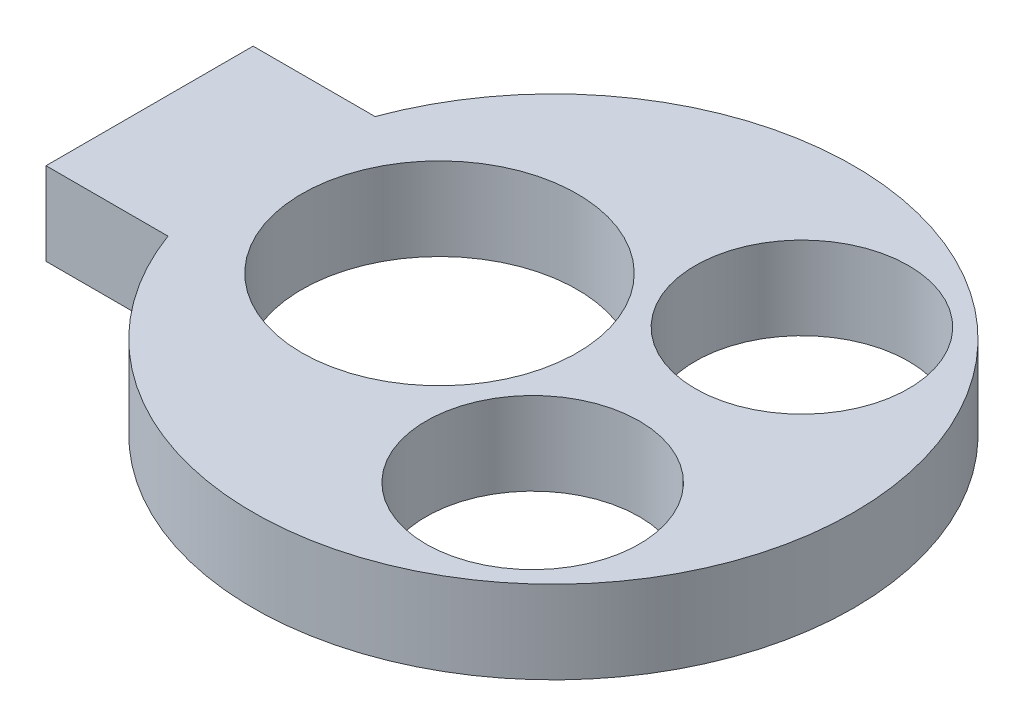
ISO-10303-21;
HEADER;
FILE_DESCRIPTION(('STEP AP214'),'2;1');
FILE_NAME('part.step','',(''),(''),'','','');
FILE_SCHEMA(('AUTOMOTIVE_DESIGN { 1 0 10303 214 1 1 1 1 }'));
ENDSEC;
DATA;
#1=APPLICATION_CONTEXT('core data for automotive mechanical design processes');
#2=APPLICATION_PROTOCOL_DEFINITION('international standard','automotive_design',2000,#1);
#3=PRODUCT_CONTEXT('',#1,'mechanical');
#4=PRODUCT('Part','Part','',(#3));
#5=PRODUCT_RELATED_PRODUCT_CATEGORY('part','',(#4));
#6=PRODUCT_DEFINITION_FORMATION('','',#4);
#7=PRODUCT_DEFINITION_CONTEXT('part definition',#1,'design');
#8=PRODUCT_DEFINITION('design','',#6,#7);
#9=PRODUCT_DEFINITION_SHAPE('','',#8);
#10=(LENGTH_UNIT() NAMED_UNIT(*) SI_UNIT(.MILLI.,.METRE.));
#11=(NAMED_UNIT(*) PLANE_ANGLE_UNIT() SI_UNIT($,.RADIAN.));
#12=(NAMED_UNIT(*) SI_UNIT($,.STERADIAN.) SOLID_ANGLE_UNIT());
#13=UNCERTAINTY_MEASURE_WITH_UNIT(LENGTH_MEASURE(1.E-05),#10,'distance_accuracy_value','');
#14=(GEOMETRIC_REPRESENTATION_CONTEXT(3) GLOBAL_UNCERTAINTY_ASSIGNED_CONTEXT((#13)) GLOBAL_UNIT_ASSIGNED_CONTEXT((#10,
#11,#12)) REPRESENTATION_CONTEXT('',''));
#15=CARTESIAN_POINT('',(0.,0.,0.));
#16=DIRECTION('',(0.,0.,1.));
#17=DIRECTION('',(1.,0.,0.));
#18=AXIS2_PLACEMENT_3D('',#15,#16,#17);
#19=CARTESIAN_POINT('',(0.,2.,0.));
#20=DIRECTION('',(0.,-1.,0.));
#21=DIRECTION('',(0.,0.,-1.));
#22=AXIS2_PLACEMENT_3D('',#19,#20,#21);
#23=CYLINDRICAL_SURFACE('',#22,14.5);
#24=DIRECTION('',(0.,-1.,0.));
#25=VECTOR('',#24,1.);
#26=CARTESIAN_POINT('',(-13.6106575888162,2.,5.));
#27=LINE('',#26,#25);
#28=CARTESIAN_POINT('',(-13.6106575888162,-2.,5.));
#29=VERTEX_POINT('',#28);
#30=CARTESIAN_POINT('',(-13.6106575888162,2.,5.));
#31=VERTEX_POINT('',#30);
#32=EDGE_CURVE('E11',#29,#31,#27,.F.);
#33=ORIENTED_EDGE('',*,*,#32,.F.);
#34=CARTESIAN_POINT('',(0.,-2.,0.));
#35=DIRECTION('',(0.,1.,0.));
#36=DIRECTION('',(0.,0.,1.));
#37=AXIS2_PLACEMENT_3D('',#34,#35,#36);
#38=CIRCLE('',#37,14.5);
#39=CARTESIAN_POINT('',(-13.6106575888162,-2.,-5.));
#40=VERTEX_POINT('',#39);
#41=EDGE_CURVE('E47',#29,#40,#38,.T.);
#42=ORIENTED_EDGE('',*,*,#41,.T.);
#43=DIRECTION('',(0.,-1.,0.));
#44=VECTOR('',#43,1.);
#45=CARTESIAN_POINT('',(-13.6106575888162,2.,-5.));
#46=LINE('',#45,#44);
#47=CARTESIAN_POINT('',(-13.6106575888162,2.,-5.));
#48=VERTEX_POINT('',#47);
#49=EDGE_CURVE('E40',#48,#40,#46,.T.);
#50=ORIENTED_EDGE('',*,*,#49,.F.);
#51=CARTESIAN_POINT('',(0.,2.,0.));
#52=DIRECTION('',(0.,1.,0.));
#53=DIRECTION('',(0.,0.,1.));
#54=AXIS2_PLACEMENT_3D('',#51,#52,#53);
#55=CIRCLE('',#54,14.5);
#56=EDGE_CURVE('E52',#31,#48,#55,.T.);
#57=ORIENTED_EDGE('',*,*,#56,.F.);
#58=EDGE_LOOP('',(#33,#42,#50,#57));
#59=FACE_BOUND('',#58,.T.);
#60=ADVANCED_FACE('F33',(#59),#23,.T.);
#61=CARTESIAN_POINT('',(0.,2.,0.));
#62=DIRECTION('',(0.,1.,0.));
#63=DIRECTION('',(0.,0.,1.));
#64=AXIS2_PLACEMENT_3D('',#61,#62,#63);
#65=PLANE('',#64);
#66=DIRECTION('',(1.,0.,0.));
#67=VECTOR('',#66,1.);
#68=CARTESIAN_POINT('',(-19.5,2.,5.));
#69=LINE('',#68,#67);
#70=CARTESIAN_POINT('',(-19.5,2.,5.));
#71=VERTEX_POINT('',#70);
#72=EDGE_CURVE('E71',#71,#31,#69,.T.);
#73=ORIENTED_EDGE('',*,*,#72,.T.);
#74=ORIENTED_EDGE('',*,*,#56,.T.);
#75=DIRECTION('',(-1.,0.,0.));
#76=VECTOR('',#75,1.);
#77=CARTESIAN_POINT('',(-12.5,2.,-5.));
#78=LINE('',#77,#76);
#79=CARTESIAN_POINT('',(-19.5,2.,-5.));
#80=VERTEX_POINT('',#79);
#81=EDGE_CURVE('E79',#48,#80,#78,.T.);
#82=ORIENTED_EDGE('',*,*,#81,.T.);
#83=DIRECTION('',(0.,0.,1.));
#84=VECTOR('',#83,1.);
#85=CARTESIAN_POINT('',(-19.5,2.,-5.));
#86=LINE('',#85,#84);
#87=EDGE_CURVE('E80',#80,#71,#86,.T.);
#88=ORIENTED_EDGE('',*,*,#87,.T.);
#89=EDGE_LOOP('',(#73,#74,#82,#88));
#90=FACE_BOUND('',#89,.T.);
#91=CARTESIAN_POINT('',(5.5,2.,6.5));
#92=DIRECTION('',(0.,1.,0.));
#93=DIRECTION('',(0.,0.,1.));
#94=AXIS2_PLACEMENT_3D('',#91,#92,#93);
#95=CIRCLE('',#94,5.15);
#96=CARTESIAN_POINT('',(5.5,2.,11.65));
#97=VERTEX_POINT('',#96);
#98=EDGE_CURVE('E106',#97,#97,#95,.T.);
#99=ORIENTED_EDGE('',*,*,#98,.F.);
#100=EDGE_LOOP('',(#99));
#101=FACE_BOUND('',#100,.T.);
#102=CARTESIAN_POINT('',(-5.5,2.,0.));
#103=DIRECTION('',(0.,1.,0.));
#104=DIRECTION('',(0.,0.,1.));
#105=AXIS2_PLACEMENT_3D('',#102,#103,#104);
#106=CIRCLE('',#105,6.65);
#107=CARTESIAN_POINT('',(-5.5,2.,6.65));
#108=VERTEX_POINT('',#107);
#109=EDGE_CURVE('E112',#108,#108,#106,.T.);
#110=ORIENTED_EDGE('',*,*,#109,.F.);
#111=EDGE_LOOP('',(#110));
#112=FACE_BOUND('',#111,.T.);
#113=CARTESIAN_POINT('',(5.5,2.,-6.5));
#114=DIRECTION('',(0.,1.,0.));
#115=DIRECTION('',(0.,0.,1.));
#116=AXIS2_PLACEMENT_3D('',#113,#114,#115);
#117=CIRCLE('',#116,5.15);
#118=CARTESIAN_POINT('',(5.5,2.,-1.35));
#119=VERTEX_POINT('',#118);
#120=EDGE_CURVE('E98',#119,#119,#117,.T.);
#121=ORIENTED_EDGE('',*,*,#120,.F.);
#122=EDGE_LOOP('',(#121));
#123=FACE_BOUND('',#122,.T.);
#124=ADVANCED_FACE('F83',(#90,#101,#112,#123),#65,.T.);
#125=CARTESIAN_POINT('',(0.,-2.,0.));
#126=DIRECTION('',(0.,1.,0.));
#127=DIRECTION('',(0.,0.,1.));
#128=AXIS2_PLACEMENT_3D('',#125,#126,#127);
#129=PLANE('',#128);
#130=ORIENTED_EDGE('',*,*,#41,.F.);
#131=DIRECTION('',(1.,0.,0.));
#132=VECTOR('',#131,1.);
#133=CARTESIAN_POINT('',(-19.5,-2.,5.));
#134=LINE('',#133,#132);
#135=CARTESIAN_POINT('',(-19.5,-2.,5.));
#136=VERTEX_POINT('',#135);
#137=EDGE_CURVE('E124',#136,#29,#134,.T.);
#138=ORIENTED_EDGE('',*,*,#137,.F.);
#139=DIRECTION('',(0.,0.,1.));
#140=VECTOR('',#139,1.);
#141=CARTESIAN_POINT('',(-19.5,-2.,-5.));
#142=LINE('',#141,#140);
#143=CARTESIAN_POINT('',(-19.5,-2.,-5.));
#144=VERTEX_POINT('',#143);
#145=EDGE_CURVE('E93',#144,#136,#142,.T.);
#146=ORIENTED_EDGE('',*,*,#145,.F.);
#147=DIRECTION('',(-1.,0.,0.));
#148=VECTOR('',#147,1.);
#149=CARTESIAN_POINT('',(-12.5,-2.,-5.));
#150=LINE('',#149,#148);
#151=EDGE_CURVE('E89',#40,#144,#150,.T.);
#152=ORIENTED_EDGE('',*,*,#151,.F.);
#153=EDGE_LOOP('',(#130,#138,#146,#152));
#154=FACE_BOUND('',#153,.T.);
#155=CARTESIAN_POINT('',(5.5,-2.,-6.5));
#156=DIRECTION('',(0.,1.,0.));
#157=DIRECTION('',(0.,0.,1.));
#158=AXIS2_PLACEMENT_3D('',#155,#156,#157);
#159=CIRCLE('',#158,5.15);
#160=CARTESIAN_POINT('',(5.5,-2.,-1.35));
#161=VERTEX_POINT('',#160);
#162=EDGE_CURVE('E94',#161,#161,#159,.T.);
#163=ORIENTED_EDGE('',*,*,#162,.T.);
#164=EDGE_LOOP('',(#163));
#165=FACE_BOUND('',#164,.T.);
#166=CARTESIAN_POINT('',(5.5,-2.,6.5));
#167=DIRECTION('',(0.,1.,0.));
#168=DIRECTION('',(0.,0.,1.));
#169=AXIS2_PLACEMENT_3D('',#166,#167,#168);
#170=CIRCLE('',#169,5.15);
#171=CARTESIAN_POINT('',(5.5,-2.,11.65));
#172=VERTEX_POINT('',#171);
#173=EDGE_CURVE('E104',#172,#172,#170,.T.);
#174=ORIENTED_EDGE('',*,*,#173,.T.);
#175=EDGE_LOOP('',(#174));
#176=FACE_BOUND('',#175,.T.);
#177=CARTESIAN_POINT('',(-5.5,-2.,0.));
#178=DIRECTION('',(0.,1.,0.));
#179=DIRECTION('',(0.,0.,1.));
#180=AXIS2_PLACEMENT_3D('',#177,#178,#179);
#181=CIRCLE('',#180,6.65);
#182=CARTESIAN_POINT('',(-5.5,-2.,6.65));
#183=VERTEX_POINT('',#182);
#184=EDGE_CURVE('E109',#183,#183,#181,.T.);
#185=ORIENTED_EDGE('',*,*,#184,.T.);
#186=EDGE_LOOP('',(#185));
#187=FACE_BOUND('',#186,.T.);
#188=ADVANCED_FACE('F122',(#154,#165,#176,#187),#129,.F.);
#189=CARTESIAN_POINT('',(-5.5,2.,0.));
#190=DIRECTION('',(0.,-1.,0.));
#191=DIRECTION('',(0.,0.,-1.));
#192=AXIS2_PLACEMENT_3D('',#189,#190,#191);
#193=CYLINDRICAL_SURFACE('',#192,6.65);
#194=ORIENTED_EDGE('',*,*,#109,.T.);
#195=EDGE_LOOP('',(#194));
#196=FACE_BOUND('',#195,.T.);
#197=ORIENTED_EDGE('',*,*,#184,.F.);
#198=EDGE_LOOP('',(#197));
#199=FACE_BOUND('',#198,.T.);
#200=ADVANCED_FACE('F136',(#196,#199),#193,.F.);
#201=CARTESIAN_POINT('',(5.5,2.,6.5));
#202=DIRECTION('',(0.,-1.,0.));
#203=DIRECTION('',(0.,0.,-1.));
#204=AXIS2_PLACEMENT_3D('',#201,#202,#203);
#205=CYLINDRICAL_SURFACE('',#204,5.15);
#206=ORIENTED_EDGE('',*,*,#98,.T.);
#207=EDGE_LOOP('',(#206));
#208=FACE_BOUND('',#207,.T.);
#209=ORIENTED_EDGE('',*,*,#173,.F.);
#210=EDGE_LOOP('',(#209));
#211=FACE_BOUND('',#210,.T.);
#212=ADVANCED_FACE('F140',(#208,#211),#205,.F.);
#213=CARTESIAN_POINT('',(5.5,2.,-6.5));
#214=DIRECTION('',(0.,-1.,0.));
#215=DIRECTION('',(0.,0.,-1.));
#216=AXIS2_PLACEMENT_3D('',#213,#214,#215);
#217=CYLINDRICAL_SURFACE('',#216,5.15);
#218=ORIENTED_EDGE('',*,*,#120,.T.);
#219=EDGE_LOOP('',(#218));
#220=FACE_BOUND('',#219,.T.);
#221=ORIENTED_EDGE('',*,*,#162,.F.);
#222=EDGE_LOOP('',(#221));
#223=FACE_BOUND('',#222,.T.);
#224=ADVANCED_FACE('F144',(#220,#223),#217,.F.);
#225=CARTESIAN_POINT('',(-19.5,2.,5.));
#226=DIRECTION('',(0.,0.,-1.));
#227=DIRECTION('',(-1.,0.,0.));
#228=AXIS2_PLACEMENT_3D('',#225,#226,#227);
#229=PLANE('',#228);
#230=ORIENTED_EDGE('',*,*,#137,.T.);
#231=ORIENTED_EDGE('',*,*,#32,.T.);
#232=ORIENTED_EDGE('',*,*,#72,.F.);
#233=DIRECTION('',(0.,-1.,0.));
#234=VECTOR('',#233,1.);
#235=CARTESIAN_POINT('',(-19.5,2.,5.));
#236=LINE('',#235,#234);
#237=EDGE_CURVE('E76',#71,#136,#236,.T.);
#238=ORIENTED_EDGE('',*,*,#237,.T.);
#239=EDGE_LOOP('',(#230,#231,#232,#238));
#240=FACE_BOUND('',#239,.T.);
#241=ADVANCED_FACE('F74',(#240),#229,.F.);
#242=CARTESIAN_POINT('',(-12.5,2.,-5.));
#243=DIRECTION('',(0.,0.,1.));
#244=DIRECTION('',(1.,0.,0.));
#245=AXIS2_PLACEMENT_3D('',#242,#243,#244);
#246=PLANE('',#245);
#247=ORIENTED_EDGE('',*,*,#81,.F.);
#248=ORIENTED_EDGE('',*,*,#49,.T.);
#249=ORIENTED_EDGE('',*,*,#151,.T.);
#250=DIRECTION('',(0.,-1.,0.));
#251=VECTOR('',#250,1.);
#252=CARTESIAN_POINT('',(-19.5,2.,-5.));
#253=LINE('',#252,#251);
#254=EDGE_CURVE('E95',#80,#144,#253,.T.);
#255=ORIENTED_EDGE('',*,*,#254,.F.);
#256=EDGE_LOOP('',(#247,#248,#249,#255));
#257=FACE_BOUND('',#256,.T.);
#258=ADVANCED_FACE('F120',(#257),#246,.F.);
#259=CARTESIAN_POINT('',(-19.5,2.,-5.));
#260=DIRECTION('',(1.,0.,0.));
#261=DIRECTION('',(0.,0.,-1.));
#262=AXIS2_PLACEMENT_3D('',#259,#260,#261);
#263=PLANE('',#262);
#264=ORIENTED_EDGE('',*,*,#145,.T.);
#265=ORIENTED_EDGE('',*,*,#237,.F.);
#266=ORIENTED_EDGE('',*,*,#87,.F.);
#267=ORIENTED_EDGE('',*,*,#254,.T.);
#268=EDGE_LOOP('',(#264,#265,#266,#267));
#269=FACE_BOUND('',#268,.T.);
#270=ADVANCED_FACE('F91',(#269),#263,.F.);
#271=CLOSED_SHELL('',(#60,#124,#188,#200,#212,#224,#241,#258,#270));
#272=MANIFOLD_SOLID_BREP('B2',#271);
#273=ADVANCED_BREP_SHAPE_REPRESENTATION('',(#18,#272),#14);
#274=SHAPE_DEFINITION_REPRESENTATION(#9,#273);
ENDSEC;
END-ISO-10303-21;
